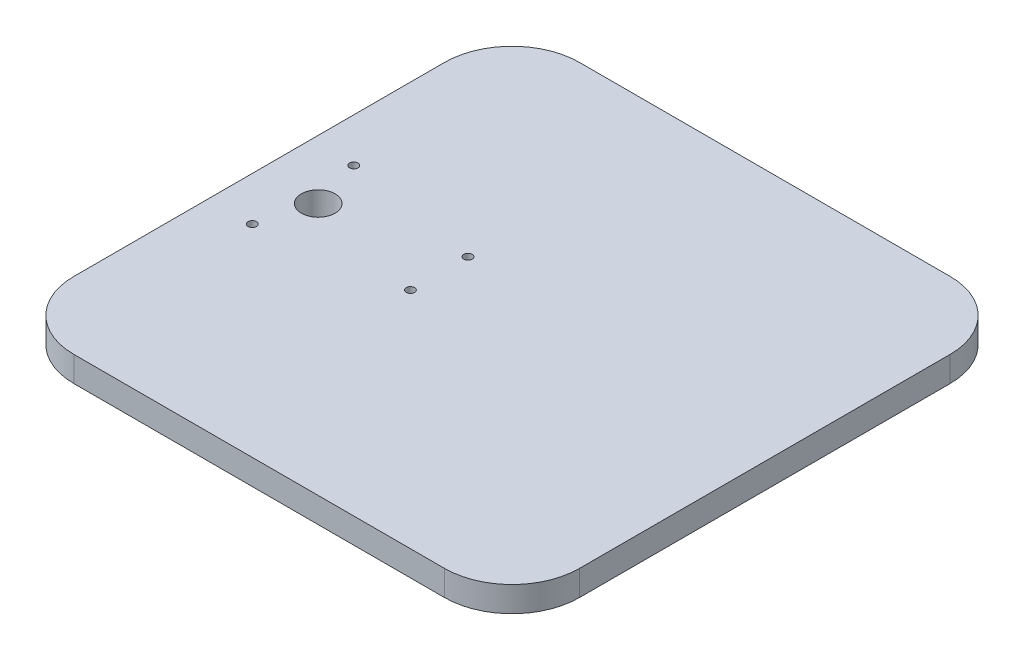
ISO-10303-21;
HEADER;
FILE_DESCRIPTION(('STEP AP214'),'2;1');
FILE_NAME('part.step','',(''),(''),'','','');
FILE_SCHEMA(('AUTOMOTIVE_DESIGN { 1 0 10303 214 1 1 1 1 }'));
ENDSEC;
DATA;
#1=APPLICATION_CONTEXT('core data for automotive mechanical design processes');
#2=APPLICATION_PROTOCOL_DEFINITION('international standard','automotive_design',2000,#1);
#3=PRODUCT_CONTEXT('',#1,'mechanical');
#4=PRODUCT('Part','Part','',(#3));
#5=PRODUCT_RELATED_PRODUCT_CATEGORY('part','',(#4));
#6=PRODUCT_DEFINITION_FORMATION('','',#4);
#7=PRODUCT_DEFINITION_CONTEXT('part definition',#1,'design');
#8=PRODUCT_DEFINITION('design','',#6,#7);
#9=PRODUCT_DEFINITION_SHAPE('','',#8);
#10=(LENGTH_UNIT() NAMED_UNIT(*) SI_UNIT(.MILLI.,.METRE.));
#11=(NAMED_UNIT(*) PLANE_ANGLE_UNIT() SI_UNIT($,.RADIAN.));
#12=(NAMED_UNIT(*) SI_UNIT($,.STERADIAN.) SOLID_ANGLE_UNIT());
#13=UNCERTAINTY_MEASURE_WITH_UNIT(LENGTH_MEASURE(1.E-05),#10,'distance_accuracy_value','');
#14=(GEOMETRIC_REPRESENTATION_CONTEXT(3) GLOBAL_UNCERTAINTY_ASSIGNED_CONTEXT((#13)) GLOBAL_UNIT_ASSIGNED_CONTEXT((#10,
#11,#12)) REPRESENTATION_CONTEXT('',''));
#15=CARTESIAN_POINT('',(0.,0.,0.));
#16=DIRECTION('',(0.,0.,1.));
#17=DIRECTION('',(1.,0.,0.));
#18=AXIS2_PLACEMENT_3D('',#15,#16,#17);
#19=CARTESIAN_POINT('',(-75.,7.5,75.));
#20=DIRECTION('',(1.,0.,0.));
#21=DIRECTION('',(0.,0.,-1.));
#22=AXIS2_PLACEMENT_3D('',#19,#20,#21);
#23=PLANE('',#22);
#24=DIRECTION('',(0.,0.,1.));
#25=VECTOR('',#24,1.);
#26=CARTESIAN_POINT('',(-75.,0.,75.));
#27=LINE('',#26,#25);
#28=CARTESIAN_POINT('',(-75.,0.,-55.));
#29=VERTEX_POINT('',#28);
#30=CARTESIAN_POINT('',(-75.,0.,55.));
#31=VERTEX_POINT('',#30);
#32=EDGE_CURVE('E182',#29,#31,#27,.T.);
#33=ORIENTED_EDGE('',*,*,#32,.T.);
#34=DIRECTION('',(0.,-1.,0.));
#35=VECTOR('',#34,1.);
#36=CARTESIAN_POINT('',(-75.,7.5,55.));
#37=LINE('',#36,#35);
#38=CARTESIAN_POINT('',(-75.,7.5,55.));
#39=VERTEX_POINT('',#38);
#40=EDGE_CURVE('E11',#31,#39,#37,.F.);
#41=ORIENTED_EDGE('',*,*,#40,.T.);
#42=DIRECTION('',(0.,0.,1.));
#43=VECTOR('',#42,1.);
#44=CARTESIAN_POINT('',(-75.,7.5,75.));
#45=LINE('',#44,#43);
#46=CARTESIAN_POINT('',(-75.,7.5,-55.));
#47=VERTEX_POINT('',#46);
#48=EDGE_CURVE('E135',#47,#39,#45,.T.);
#49=ORIENTED_EDGE('',*,*,#48,.F.);
#50=DIRECTION('',(0.,-1.,0.));
#51=VECTOR('',#50,1.);
#52=CARTESIAN_POINT('',(-75.,7.5,-55.));
#53=LINE('',#52,#51);
#54=EDGE_CURVE('E48',#47,#29,#53,.T.);
#55=ORIENTED_EDGE('',*,*,#54,.T.);
#56=EDGE_LOOP('',(#33,#41,#49,#55));
#57=FACE_BOUND('',#56,.T.);
#58=ADVANCED_FACE('F39',(#57),#23,.F.);
#59=CARTESIAN_POINT('',(75.,7.5,75.));
#60=DIRECTION('',(0.,0.,-1.));
#61=DIRECTION('',(-1.,0.,0.));
#62=AXIS2_PLACEMENT_3D('',#59,#60,#61);
#63=PLANE('',#62);
#64=DIRECTION('',(1.,0.,0.));
#65=VECTOR('',#64,1.);
#66=CARTESIAN_POINT('',(75.,0.,75.));
#67=LINE('',#66,#65);
#68=CARTESIAN_POINT('',(-55.,0.,75.));
#69=VERTEX_POINT('',#68);
#70=CARTESIAN_POINT('',(55.,0.,75.));
#71=VERTEX_POINT('',#70);
#72=EDGE_CURVE('E142',#69,#71,#67,.T.);
#73=ORIENTED_EDGE('',*,*,#72,.T.);
#74=DIRECTION('',(0.,-1.,0.));
#75=VECTOR('',#74,1.);
#76=CARTESIAN_POINT('',(55.,7.5,75.));
#77=LINE('',#76,#75);
#78=CARTESIAN_POINT('',(55.,7.5,75.));
#79=VERTEX_POINT('',#78);
#80=EDGE_CURVE('E55',#71,#79,#77,.F.);
#81=ORIENTED_EDGE('',*,*,#80,.T.);
#82=DIRECTION('',(1.,0.,0.));
#83=VECTOR('',#82,1.);
#84=CARTESIAN_POINT('',(75.,7.5,75.));
#85=LINE('',#84,#83);
#86=CARTESIAN_POINT('',(-55.,7.5,75.));
#87=VERTEX_POINT('',#86);
#88=EDGE_CURVE('E140',#87,#79,#85,.T.);
#89=ORIENTED_EDGE('',*,*,#88,.F.);
#90=DIRECTION('',(0.,-1.,0.));
#91=VECTOR('',#90,1.);
#92=CARTESIAN_POINT('',(-55.,7.5,75.));
#93=LINE('',#92,#91);
#94=EDGE_CURVE('E171',#87,#69,#93,.T.);
#95=ORIENTED_EDGE('',*,*,#94,.T.);
#96=EDGE_LOOP('',(#73,#81,#89,#95));
#97=FACE_BOUND('',#96,.T.);
#98=ADVANCED_FACE('F258',(#97),#63,.F.);
#99=CARTESIAN_POINT('',(75.,7.5,75.));
#100=DIRECTION('',(-1.,0.,0.));
#101=DIRECTION('',(0.,0.,1.));
#102=AXIS2_PLACEMENT_3D('',#99,#100,#101);
#103=PLANE('',#102);
#104=DIRECTION('',(0.,0.,-1.));
#105=VECTOR('',#104,1.);
#106=CARTESIAN_POINT('',(75.,0.,75.));
#107=LINE('',#106,#105);
#108=CARTESIAN_POINT('',(75.,0.,55.));
#109=VERTEX_POINT('',#108);
#110=CARTESIAN_POINT('',(75.,0.,-55.));
#111=VERTEX_POINT('',#110);
#112=EDGE_CURVE('E136',#109,#111,#107,.T.);
#113=ORIENTED_EDGE('',*,*,#112,.T.);
#114=DIRECTION('',(0.,-1.,0.));
#115=VECTOR('',#114,1.);
#116=CARTESIAN_POINT('',(75.,7.5,-55.));
#117=LINE('',#116,#115);
#118=CARTESIAN_POINT('',(75.,7.5,-55.));
#119=VERTEX_POINT('',#118);
#120=EDGE_CURVE('E111',#111,#119,#117,.F.);
#121=ORIENTED_EDGE('',*,*,#120,.T.);
#122=DIRECTION('',(0.,0.,-1.));
#123=VECTOR('',#122,1.);
#124=CARTESIAN_POINT('',(75.,7.5,75.));
#125=LINE('',#124,#123);
#126=CARTESIAN_POINT('',(75.,7.5,55.));
#127=VERTEX_POINT('',#126);
#128=EDGE_CURVE('E198',#127,#119,#125,.T.);
#129=ORIENTED_EDGE('',*,*,#128,.F.);
#130=DIRECTION('',(0.,-1.,0.));
#131=VECTOR('',#130,1.);
#132=CARTESIAN_POINT('',(75.,7.5,55.));
#133=LINE('',#132,#131);
#134=EDGE_CURVE('E117',#127,#109,#133,.T.);
#135=ORIENTED_EDGE('',*,*,#134,.T.);
#136=EDGE_LOOP('',(#113,#121,#129,#135));
#137=FACE_BOUND('',#136,.T.);
#138=ADVANCED_FACE('F263',(#137),#103,.F.);
#139=CARTESIAN_POINT('',(75.,7.5,-75.));
#140=DIRECTION('',(0.,0.,1.));
#141=DIRECTION('',(1.,0.,0.));
#142=AXIS2_PLACEMENT_3D('',#139,#140,#141);
#143=PLANE('',#142);
#144=DIRECTION('',(-1.,0.,0.));
#145=VECTOR('',#144,1.);
#146=CARTESIAN_POINT('',(75.,7.5,-75.));
#147=LINE('',#146,#145);
#148=CARTESIAN_POINT('',(55.,7.5,-75.));
#149=VERTEX_POINT('',#148);
#150=CARTESIAN_POINT('',(-55.,7.5,-75.));
#151=VERTEX_POINT('',#150);
#152=EDGE_CURVE('E127',#149,#151,#147,.T.);
#153=ORIENTED_EDGE('',*,*,#152,.F.);
#154=DIRECTION('',(0.,-1.,0.));
#155=VECTOR('',#154,1.);
#156=CARTESIAN_POINT('',(55.,7.5,-75.));
#157=LINE('',#156,#155);
#158=CARTESIAN_POINT('',(55.,0.,-75.));
#159=VERTEX_POINT('',#158);
#160=EDGE_CURVE('E110',#149,#159,#157,.T.);
#161=ORIENTED_EDGE('',*,*,#160,.T.);
#162=DIRECTION('',(-1.,0.,0.));
#163=VECTOR('',#162,1.);
#164=CARTESIAN_POINT('',(75.,0.,-75.));
#165=LINE('',#164,#163);
#166=CARTESIAN_POINT('',(-55.,0.,-75.));
#167=VERTEX_POINT('',#166);
#168=EDGE_CURVE('E124',#159,#167,#165,.T.);
#169=ORIENTED_EDGE('',*,*,#168,.T.);
#170=DIRECTION('',(0.,-1.,0.));
#171=VECTOR('',#170,1.);
#172=CARTESIAN_POINT('',(-55.,7.5,-75.));
#173=LINE('',#172,#171);
#174=EDGE_CURVE('E130',#167,#151,#173,.F.);
#175=ORIENTED_EDGE('',*,*,#174,.T.);
#176=EDGE_LOOP('',(#153,#161,#169,#175));
#177=FACE_BOUND('',#176,.T.);
#178=ADVANCED_FACE('F123',(#177),#143,.F.);
#179=CARTESIAN_POINT('',(0.,7.5,0.));
#180=DIRECTION('',(0.,1.,0.));
#181=DIRECTION('',(0.,0.,1.));
#182=AXIS2_PLACEMENT_3D('',#179,#180,#181);
#183=PLANE('',#182);
#184=CARTESIAN_POINT('',(-61.9857466338404,7.5,15.05));
#185=DIRECTION('',(0.,1.,0.));
#186=DIRECTION('',(0.,0.,1.));
#187=AXIS2_PLACEMENT_3D('',#184,#185,#186);
#188=CIRCLE('',#187,1.25);
#189=CARTESIAN_POINT('',(-61.9857466338404,7.5,16.3));
#190=VERTEX_POINT('',#189);
#191=EDGE_CURVE('E188',#190,#190,#188,.T.);
#192=ORIENTED_EDGE('',*,*,#191,.F.);
#193=EDGE_LOOP('',(#192));
#194=FACE_BOUND('',#193,.T.);
#195=CARTESIAN_POINT('',(-57.4857466338404,7.5,0.));
#196=DIRECTION('',(0.,1.,0.));
#197=DIRECTION('',(0.,0.,1.));
#198=AXIS2_PLACEMENT_3D('',#195,#196,#197);
#199=CIRCLE('',#198,5.);
#200=CARTESIAN_POINT('',(-57.4857466338404,7.5,5.));
#201=VERTEX_POINT('',#200);
#202=EDGE_CURVE('E193',#201,#201,#199,.T.);
#203=ORIENTED_EDGE('',*,*,#202,.F.);
#204=EDGE_LOOP('',(#203));
#205=FACE_BOUND('',#204,.T.);
#206=CARTESIAN_POINT('',(-21.5857466338404,7.5,-8.55));
#207=DIRECTION('',(0.,1.,0.));
#208=DIRECTION('',(0.,0.,1.));
#209=AXIS2_PLACEMENT_3D('',#206,#207,#208);
#210=CIRCLE('',#209,1.25);
#211=CARTESIAN_POINT('',(-21.5857466338404,7.5,-7.3));
#212=VERTEX_POINT('',#211);
#213=EDGE_CURVE('E207',#212,#212,#210,.T.);
#214=ORIENTED_EDGE('',*,*,#213,.F.);
#215=EDGE_LOOP('',(#214));
#216=FACE_BOUND('',#215,.T.);
#217=CARTESIAN_POINT('',(-21.5857466338404,7.5,8.55));
#218=DIRECTION('',(0.,1.,0.));
#219=DIRECTION('',(0.,0.,1.));
#220=AXIS2_PLACEMENT_3D('',#217,#218,#219);
#221=CIRCLE('',#220,1.25);
#222=CARTESIAN_POINT('',(-21.5857466338404,7.5,9.8));
#223=VERTEX_POINT('',#222);
#224=EDGE_CURVE('E211',#223,#223,#221,.T.);
#225=ORIENTED_EDGE('',*,*,#224,.F.);
#226=EDGE_LOOP('',(#225));
#227=FACE_BOUND('',#226,.T.);
#228=CARTESIAN_POINT('',(-61.9857466338404,7.5,-15.05));
#229=DIRECTION('',(0.,1.,0.));
#230=DIRECTION('',(0.,0.,1.));
#231=AXIS2_PLACEMENT_3D('',#228,#229,#230);
#232=CIRCLE('',#231,1.25);
#233=CARTESIAN_POINT('',(-61.9857466338404,7.5,-13.8));
#234=VERTEX_POINT('',#233);
#235=EDGE_CURVE('E215',#234,#234,#232,.T.);
#236=ORIENTED_EDGE('',*,*,#235,.F.);
#237=EDGE_LOOP('',(#236));
#238=FACE_BOUND('',#237,.T.);
#239=ORIENTED_EDGE('',*,*,#128,.T.);
#240=CARTESIAN_POINT('',(55.,7.5,-55.));
#241=DIRECTION('',(0.,1.,0.));
#242=DIRECTION('',(0.,0.,1.));
#243=AXIS2_PLACEMENT_3D('',#240,#241,#242);
#244=CIRCLE('',#243,20.);
#245=EDGE_CURVE('E168',#119,#149,#244,.T.);
#246=ORIENTED_EDGE('',*,*,#245,.T.);
#247=ORIENTED_EDGE('',*,*,#152,.T.);
#248=CARTESIAN_POINT('',(-55.,7.5,-55.));
#249=DIRECTION('',(0.,1.,0.));
#250=DIRECTION('',(0.,0.,1.));
#251=AXIS2_PLACEMENT_3D('',#248,#249,#250);
#252=CIRCLE('',#251,20.);
#253=EDGE_CURVE('E160',#151,#47,#252,.T.);
#254=ORIENTED_EDGE('',*,*,#253,.T.);
#255=ORIENTED_EDGE('',*,*,#48,.T.);
#256=CARTESIAN_POINT('',(-55.,7.5,55.));
#257=DIRECTION('',(0.,1.,0.));
#258=DIRECTION('',(0.,0.,1.));
#259=AXIS2_PLACEMENT_3D('',#256,#257,#258);
#260=CIRCLE('',#259,20.);
#261=EDGE_CURVE('E62',#39,#87,#260,.T.);
#262=ORIENTED_EDGE('',*,*,#261,.T.);
#263=ORIENTED_EDGE('',*,*,#88,.T.);
#264=CARTESIAN_POINT('',(55.,7.5,55.));
#265=DIRECTION('',(0.,1.,0.));
#266=DIRECTION('',(0.,0.,1.));
#267=AXIS2_PLACEMENT_3D('',#264,#265,#266);
#268=CIRCLE('',#267,20.);
#269=EDGE_CURVE('E165',#79,#127,#268,.T.);
#270=ORIENTED_EDGE('',*,*,#269,.T.);
#271=EDGE_LOOP('',(#239,#246,#247,#254,#255,#262,#263,#270));
#272=FACE_BOUND('',#271,.T.);
#273=ADVANCED_FACE('F280',(#194,#205,#216,#227,#238,#272),#183,.T.);
#274=CARTESIAN_POINT('',(0.,0.,0.));
#275=DIRECTION('',(0.,1.,0.));
#276=DIRECTION('',(0.,0.,1.));
#277=AXIS2_PLACEMENT_3D('',#274,#275,#276);
#278=PLANE('',#277);
#279=CARTESIAN_POINT('',(-61.9857466338404,0.,15.05));
#280=DIRECTION('',(0.,1.,0.));
#281=DIRECTION('',(0.,0.,1.));
#282=AXIS2_PLACEMENT_3D('',#279,#280,#281);
#283=CIRCLE('',#282,1.25);
#284=CARTESIAN_POINT('',(-61.9857466338404,0.,16.3));
#285=VERTEX_POINT('',#284);
#286=EDGE_CURVE('E219',#285,#285,#283,.T.);
#287=ORIENTED_EDGE('',*,*,#286,.T.);
#288=EDGE_LOOP('',(#287));
#289=FACE_BOUND('',#288,.T.);
#290=CARTESIAN_POINT('',(-57.4857466338404,0.,0.));
#291=DIRECTION('',(0.,1.,0.));
#292=DIRECTION('',(0.,0.,1.));
#293=AXIS2_PLACEMENT_3D('',#290,#291,#292);
#294=CIRCLE('',#293,5.);
#295=CARTESIAN_POINT('',(-57.4857466338404,0.,5.));
#296=VERTEX_POINT('',#295);
#297=EDGE_CURVE('E229',#296,#296,#294,.T.);
#298=ORIENTED_EDGE('',*,*,#297,.T.);
#299=EDGE_LOOP('',(#298));
#300=FACE_BOUND('',#299,.T.);
#301=CARTESIAN_POINT('',(-21.5857466338404,0.,-8.55));
#302=DIRECTION('',(0.,1.,0.));
#303=DIRECTION('',(0.,0.,1.));
#304=AXIS2_PLACEMENT_3D('',#301,#302,#303);
#305=CIRCLE('',#304,1.25);
#306=CARTESIAN_POINT('',(-21.5857466338404,0.,-7.3));
#307=VERTEX_POINT('',#306);
#308=EDGE_CURVE('E225',#307,#307,#305,.T.);
#309=ORIENTED_EDGE('',*,*,#308,.T.);
#310=EDGE_LOOP('',(#309));
#311=FACE_BOUND('',#310,.T.);
#312=CARTESIAN_POINT('',(-21.5857466338404,0.,8.55));
#313=DIRECTION('',(0.,1.,0.));
#314=DIRECTION('',(0.,0.,-1.));
#315=AXIS2_PLACEMENT_3D('',#312,#313,#314);
#316=CIRCLE('',#315,1.25);
#317=CARTESIAN_POINT('',(-21.5857466338404,0.,7.3));
#318=VERTEX_POINT('',#317);
#319=EDGE_CURVE('E220',#318,#318,#316,.T.);
#320=ORIENTED_EDGE('',*,*,#319,.T.);
#321=EDGE_LOOP('',(#320));
#322=FACE_BOUND('',#321,.T.);
#323=CARTESIAN_POINT('',(-61.9857466338404,0.,-15.05));
#324=DIRECTION('',(0.,1.,0.));
#325=DIRECTION('',(0.,0.,1.));
#326=AXIS2_PLACEMENT_3D('',#323,#324,#325);
#327=CIRCLE('',#326,1.25);
#328=CARTESIAN_POINT('',(-61.9857466338404,0.,-13.8));
#329=VERTEX_POINT('',#328);
#330=EDGE_CURVE('E224',#329,#329,#327,.T.);
#331=ORIENTED_EDGE('',*,*,#330,.T.);
#332=EDGE_LOOP('',(#331));
#333=FACE_BOUND('',#332,.T.);
#334=ORIENTED_EDGE('',*,*,#168,.F.);
#335=CARTESIAN_POINT('',(55.,0.,-55.));
#336=DIRECTION('',(0.,1.,0.));
#337=DIRECTION('',(0.,0.,1.));
#338=AXIS2_PLACEMENT_3D('',#335,#336,#337);
#339=CIRCLE('',#338,20.);
#340=EDGE_CURVE('E106',#159,#111,#339,.F.);
#341=ORIENTED_EDGE('',*,*,#340,.T.);
#342=ORIENTED_EDGE('',*,*,#112,.F.);
#343=CARTESIAN_POINT('',(55.,0.,55.));
#344=DIRECTION('',(0.,1.,0.));
#345=DIRECTION('',(0.,0.,1.));
#346=AXIS2_PLACEMENT_3D('',#343,#344,#345);
#347=CIRCLE('',#346,20.);
#348=EDGE_CURVE('E118',#109,#71,#347,.F.);
#349=ORIENTED_EDGE('',*,*,#348,.T.);
#350=ORIENTED_EDGE('',*,*,#72,.F.);
#351=CARTESIAN_POINT('',(-55.,0.,55.));
#352=DIRECTION('',(0.,1.,0.));
#353=DIRECTION('',(0.,0.,1.));
#354=AXIS2_PLACEMENT_3D('',#351,#352,#353);
#355=CIRCLE('',#354,20.);
#356=EDGE_CURVE('E150',#69,#31,#355,.F.);
#357=ORIENTED_EDGE('',*,*,#356,.T.);
#358=ORIENTED_EDGE('',*,*,#32,.F.);
#359=CARTESIAN_POINT('',(-55.,0.,-55.));
#360=DIRECTION('',(0.,1.,0.));
#361=DIRECTION('',(0.,0.,1.));
#362=AXIS2_PLACEMENT_3D('',#359,#360,#361);
#363=CIRCLE('',#362,20.);
#364=EDGE_CURVE('E129',#29,#167,#363,.F.);
#365=ORIENTED_EDGE('',*,*,#364,.T.);
#366=EDGE_LOOP('',(#334,#341,#342,#349,#350,#357,#358,#365));
#367=FACE_BOUND('',#366,.T.);
#368=ADVANCED_FACE('F132',(#289,#300,#311,#322,#333,#367),#278,.F.);
#369=CARTESIAN_POINT('',(-61.9857466338404,0.,-15.05));
#370=DIRECTION('',(0.,1.,0.));
#371=DIRECTION('',(0.,0.,1.));
#372=AXIS2_PLACEMENT_3D('',#369,#370,#371);
#373=CYLINDRICAL_SURFACE('',#372,1.25);
#374=ORIENTED_EDGE('',*,*,#235,.T.);
#375=EDGE_LOOP('',(#374));
#376=FACE_BOUND('',#375,.T.);
#377=ORIENTED_EDGE('',*,*,#330,.F.);
#378=EDGE_LOOP('',(#377));
#379=FACE_BOUND('',#378,.T.);
#380=ADVANCED_FACE('F288',(#376,#379),#373,.F.);
#381=CARTESIAN_POINT('',(-21.5857466338404,0.,8.55));
#382=DIRECTION('',(0.,1.,0.));
#383=DIRECTION('',(0.,0.,1.));
#384=AXIS2_PLACEMENT_3D('',#381,#382,#383);
#385=CYLINDRICAL_SURFACE('',#384,1.25);
#386=ORIENTED_EDGE('',*,*,#224,.T.);
#387=EDGE_LOOP('',(#386));
#388=FACE_BOUND('',#387,.T.);
#389=ORIENTED_EDGE('',*,*,#319,.F.);
#390=EDGE_LOOP('',(#389));
#391=FACE_BOUND('',#390,.T.);
#392=ADVANCED_FACE('F294',(#388,#391),#385,.F.);
#393=CARTESIAN_POINT('',(-21.5857466338404,0.,-8.55));
#394=DIRECTION('',(0.,1.,0.));
#395=DIRECTION('',(0.,0.,1.));
#396=AXIS2_PLACEMENT_3D('',#393,#394,#395);
#397=CYLINDRICAL_SURFACE('',#396,1.25);
#398=ORIENTED_EDGE('',*,*,#213,.T.);
#399=EDGE_LOOP('',(#398));
#400=FACE_BOUND('',#399,.T.);
#401=ORIENTED_EDGE('',*,*,#308,.F.);
#402=EDGE_LOOP('',(#401));
#403=FACE_BOUND('',#402,.T.);
#404=ADVANCED_FACE('F253',(#400,#403),#397,.F.);
#405=CARTESIAN_POINT('',(-57.4857466338404,0.,0.));
#406=DIRECTION('',(0.,1.,0.));
#407=DIRECTION('',(0.,0.,1.));
#408=AXIS2_PLACEMENT_3D('',#405,#406,#407);
#409=CYLINDRICAL_SURFACE('',#408,5.);
#410=ORIENTED_EDGE('',*,*,#202,.T.);
#411=EDGE_LOOP('',(#410));
#412=FACE_BOUND('',#411,.T.);
#413=ORIENTED_EDGE('',*,*,#297,.F.);
#414=EDGE_LOOP('',(#413));
#415=FACE_BOUND('',#414,.T.);
#416=ADVANCED_FACE('F244',(#412,#415),#409,.F.);
#417=CARTESIAN_POINT('',(-61.9857466338404,0.,15.05));
#418=DIRECTION('',(0.,1.,0.));
#419=DIRECTION('',(0.,0.,1.));
#420=AXIS2_PLACEMENT_3D('',#417,#418,#419);
#421=CYLINDRICAL_SURFACE('',#420,1.25);
#422=ORIENTED_EDGE('',*,*,#191,.T.);
#423=EDGE_LOOP('',(#422));
#424=FACE_BOUND('',#423,.T.);
#425=ORIENTED_EDGE('',*,*,#286,.F.);
#426=EDGE_LOOP('',(#425));
#427=FACE_BOUND('',#426,.T.);
#428=ADVANCED_FACE('F242',(#424,#427),#421,.F.);
#429=CARTESIAN_POINT('',(55.,7.5,-55.));
#430=DIRECTION('',(0.,-1.,0.));
#431=DIRECTION('',(0.,0.,-1.));
#432=AXIS2_PLACEMENT_3D('',#429,#430,#431);
#433=CYLINDRICAL_SURFACE('',#432,20.);
#434=ORIENTED_EDGE('',*,*,#245,.F.);
#435=ORIENTED_EDGE('',*,*,#120,.F.);
#436=ORIENTED_EDGE('',*,*,#340,.F.);
#437=ORIENTED_EDGE('',*,*,#160,.F.);
#438=EDGE_LOOP('',(#434,#435,#436,#437));
#439=FACE_BOUND('',#438,.T.);
#440=ADVANCED_FACE('F109',(#439),#433,.T.);
#441=CARTESIAN_POINT('',(55.,7.5,55.));
#442=DIRECTION('',(0.,-1.,0.));
#443=DIRECTION('',(0.,0.,-1.));
#444=AXIS2_PLACEMENT_3D('',#441,#442,#443);
#445=CYLINDRICAL_SURFACE('',#444,20.);
#446=ORIENTED_EDGE('',*,*,#269,.F.);
#447=ORIENTED_EDGE('',*,*,#80,.F.);
#448=ORIENTED_EDGE('',*,*,#348,.F.);
#449=ORIENTED_EDGE('',*,*,#134,.F.);
#450=EDGE_LOOP('',(#446,#447,#448,#449));
#451=FACE_BOUND('',#450,.T.);
#452=ADVANCED_FACE('F251',(#451),#445,.T.);
#453=CARTESIAN_POINT('',(-55.,7.5,55.));
#454=DIRECTION('',(0.,-1.,0.));
#455=DIRECTION('',(0.,0.,-1.));
#456=AXIS2_PLACEMENT_3D('',#453,#454,#455);
#457=CYLINDRICAL_SURFACE('',#456,20.);
#458=ORIENTED_EDGE('',*,*,#261,.F.);
#459=ORIENTED_EDGE('',*,*,#40,.F.);
#460=ORIENTED_EDGE('',*,*,#356,.F.);
#461=ORIENTED_EDGE('',*,*,#94,.F.);
#462=EDGE_LOOP('',(#458,#459,#460,#461));
#463=FACE_BOUND('',#462,.T.);
#464=ADVANCED_FACE('F268',(#463),#457,.T.);
#465=CARTESIAN_POINT('',(-55.,7.5,-55.));
#466=DIRECTION('',(0.,-1.,0.));
#467=DIRECTION('',(0.,0.,-1.));
#468=AXIS2_PLACEMENT_3D('',#465,#466,#467);
#469=CYLINDRICAL_SURFACE('',#468,20.);
#470=ORIENTED_EDGE('',*,*,#253,.F.);
#471=ORIENTED_EDGE('',*,*,#174,.F.);
#472=ORIENTED_EDGE('',*,*,#364,.F.);
#473=ORIENTED_EDGE('',*,*,#54,.F.);
#474=EDGE_LOOP('',(#470,#471,#472,#473));
#475=FACE_BOUND('',#474,.T.);
#476=ADVANCED_FACE('F41',(#475),#469,.T.);
#477=CLOSED_SHELL('',(#58,#98,#138,#178,#273,#368,#380,#392,#404,#416,#428,#440,#452,#464,#476));
#478=MANIFOLD_SOLID_BREP('B2',#477);
#479=ADVANCED_BREP_SHAPE_REPRESENTATION('',(#18,#478),#14);
#480=SHAPE_DEFINITION_REPRESENTATION(#9,#479);
ENDSEC;
END-ISO-10303-21;
